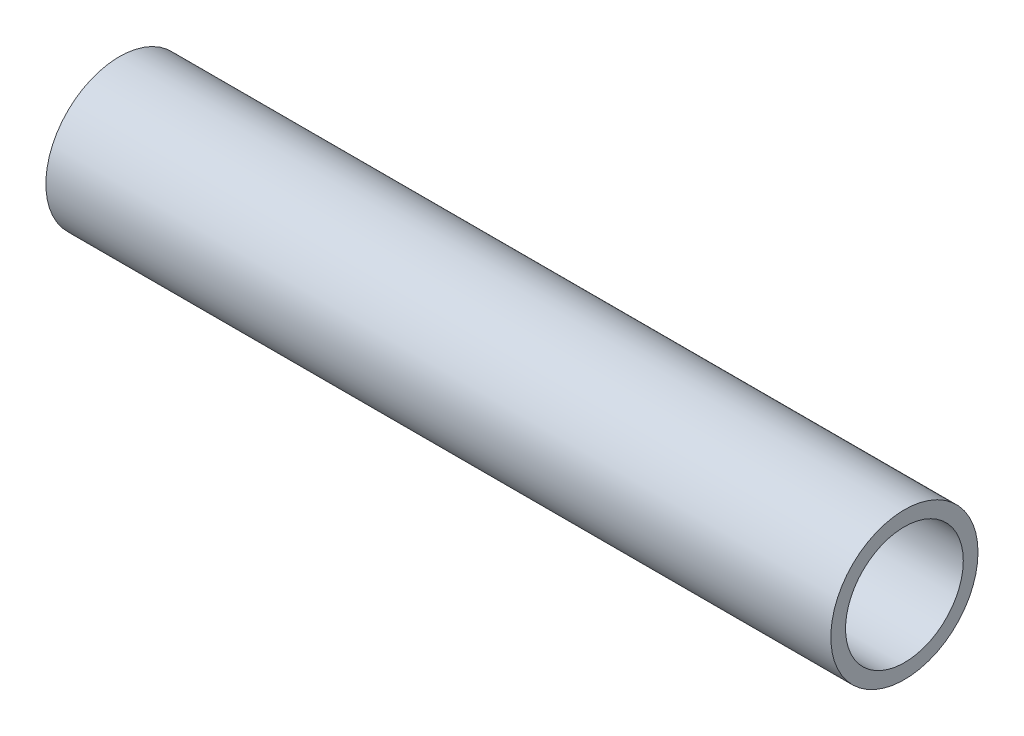
ISO-10303-21;
HEADER;
FILE_DESCRIPTION(('STEP AP214'),'2;1');
FILE_NAME('part.step','',(''),(''),'','','');
FILE_SCHEMA(('AUTOMOTIVE_DESIGN { 1 0 10303 214 1 1 1 1 }'));
ENDSEC;
DATA;
#1=APPLICATION_CONTEXT('core data for automotive mechanical design processes');
#2=APPLICATION_PROTOCOL_DEFINITION('international standard','automotive_design',2000,#1);
#3=PRODUCT_CONTEXT('',#1,'mechanical');
#4=PRODUCT('Part','Part','',(#3));
#5=PRODUCT_RELATED_PRODUCT_CATEGORY('part','',(#4));
#6=PRODUCT_DEFINITION_FORMATION('','',#4);
#7=PRODUCT_DEFINITION_CONTEXT('part definition',#1,'design');
#8=PRODUCT_DEFINITION('design','',#6,#7);
#9=PRODUCT_DEFINITION_SHAPE('','',#8);
#10=(LENGTH_UNIT() NAMED_UNIT(*) SI_UNIT(.MILLI.,.METRE.));
#11=(NAMED_UNIT(*) PLANE_ANGLE_UNIT() SI_UNIT($,.RADIAN.));
#12=(NAMED_UNIT(*) SI_UNIT($,.STERADIAN.) SOLID_ANGLE_UNIT());
#13=UNCERTAINTY_MEASURE_WITH_UNIT(LENGTH_MEASURE(1.E-05),#10,'distance_accuracy_value','');
#14=(GEOMETRIC_REPRESENTATION_CONTEXT(3) GLOBAL_UNCERTAINTY_ASSIGNED_CONTEXT((#13)) GLOBAL_UNIT_ASSIGNED_CONTEXT((#10,
#11,#12)) REPRESENTATION_CONTEXT('',''));
#15=CARTESIAN_POINT('',(0.,0.,0.));
#16=DIRECTION('',(0.,0.,1.));
#17=DIRECTION('',(1.,0.,0.));
#18=AXIS2_PLACEMENT_3D('',#15,#16,#17);
#19=CARTESIAN_POINT('',(-40.,0.,0.));
#20=DIRECTION('',(1.,0.,0.));
#21=DIRECTION('',(0.,0.,-1.));
#22=AXIS2_PLACEMENT_3D('',#19,#20,#21);
#23=CYLINDRICAL_SURFACE('',#22,7.5);
#24=CARTESIAN_POINT('',(-40.,0.,0.));
#25=DIRECTION('',(1.,0.,0.));
#26=DIRECTION('',(0.,0.,-1.));
#27=AXIS2_PLACEMENT_3D('',#24,#25,#26);
#28=CIRCLE('',#27,7.5);
#29=CARTESIAN_POINT('',(-40.,0.,-7.5));
#30=VERTEX_POINT('',#29);
#31=EDGE_CURVE('E10',#30,#30,#28,.T.);
#32=ORIENTED_EDGE('',*,*,#31,.T.);
#33=EDGE_LOOP('',(#32));
#34=FACE_BOUND('',#33,.T.);
#35=CARTESIAN_POINT('',(40.,0.,0.));
#36=DIRECTION('',(1.,0.,0.));
#37=DIRECTION('',(0.,0.,-1.));
#38=AXIS2_PLACEMENT_3D('',#35,#36,#37);
#39=CIRCLE('',#38,7.5);
#40=CARTESIAN_POINT('',(40.,0.,-7.5));
#41=VERTEX_POINT('',#40);
#42=EDGE_CURVE('E45',#41,#41,#39,.T.);
#43=ORIENTED_EDGE('',*,*,#42,.F.);
#44=EDGE_LOOP('',(#43));
#45=FACE_BOUND('',#44,.T.);
#46=ADVANCED_FACE('F35',(#34,#45),#23,.T.);
#47=CARTESIAN_POINT('',(-40.,0.,0.));
#48=DIRECTION('',(1.,0.,0.));
#49=DIRECTION('',(0.,0.,-1.));
#50=AXIS2_PLACEMENT_3D('',#47,#48,#49);
#51=PLANE('',#50);
#52=CARTESIAN_POINT('',(-40.,0.,0.));
#53=DIRECTION('',(1.,0.,0.));
#54=DIRECTION('',(0.,0.,-1.));
#55=AXIS2_PLACEMENT_3D('',#52,#53,#54);
#56=CIRCLE('',#55,6.);
#57=CARTESIAN_POINT('',(-40.,0.,-6.));
#58=VERTEX_POINT('',#57);
#59=EDGE_CURVE('E41',#58,#58,#56,.T.);
#60=ORIENTED_EDGE('',*,*,#59,.T.);
#61=EDGE_LOOP('',(#60));
#62=FACE_BOUND('',#61,.T.);
#63=ORIENTED_EDGE('',*,*,#31,.F.);
#64=EDGE_LOOP('',(#63));
#65=FACE_BOUND('',#64,.T.);
#66=ADVANCED_FACE('F64',(#62,#65),#51,.F.);
#67=CARTESIAN_POINT('',(-40.,0.,0.));
#68=DIRECTION('',(1.,0.,0.));
#69=DIRECTION('',(0.,0.,-1.));
#70=AXIS2_PLACEMENT_3D('',#67,#68,#69);
#71=CYLINDRICAL_SURFACE('',#70,6.);
#72=ORIENTED_EDGE('',*,*,#59,.F.);
#73=EDGE_LOOP('',(#72));
#74=FACE_BOUND('',#73,.T.);
#75=CARTESIAN_POINT('',(40.,0.,0.));
#76=DIRECTION('',(1.,0.,0.));
#77=DIRECTION('',(0.,0.,-1.));
#78=AXIS2_PLACEMENT_3D('',#75,#76,#77);
#79=CIRCLE('',#78,6.);
#80=CARTESIAN_POINT('',(40.,0.,-6.));
#81=VERTEX_POINT('',#80);
#82=EDGE_CURVE('E49',#81,#81,#79,.T.);
#83=ORIENTED_EDGE('',*,*,#82,.T.);
#84=EDGE_LOOP('',(#83));
#85=FACE_BOUND('',#84,.T.);
#86=ADVANCED_FACE('F55',(#74,#85),#71,.F.);
#87=CARTESIAN_POINT('',(40.,0.,0.));
#88=DIRECTION('',(1.,0.,0.));
#89=DIRECTION('',(0.,0.,-1.));
#90=AXIS2_PLACEMENT_3D('',#87,#88,#89);
#91=PLANE('',#90);
#92=ORIENTED_EDGE('',*,*,#42,.T.);
#93=EDGE_LOOP('',(#92));
#94=FACE_BOUND('',#93,.T.);
#95=ORIENTED_EDGE('',*,*,#82,.F.);
#96=EDGE_LOOP('',(#95));
#97=FACE_BOUND('',#96,.T.);
#98=ADVANCED_FACE('F57',(#94,#97),#91,.T.);
#99=CLOSED_SHELL('',(#46,#66,#86,#98));
#100=MANIFOLD_SOLID_BREP('B2',#99);
#101=ADVANCED_BREP_SHAPE_REPRESENTATION('',(#18,#100),#14);
#102=SHAPE_DEFINITION_REPRESENTATION(#9,#101);
ENDSEC;
END-ISO-10303-21;
